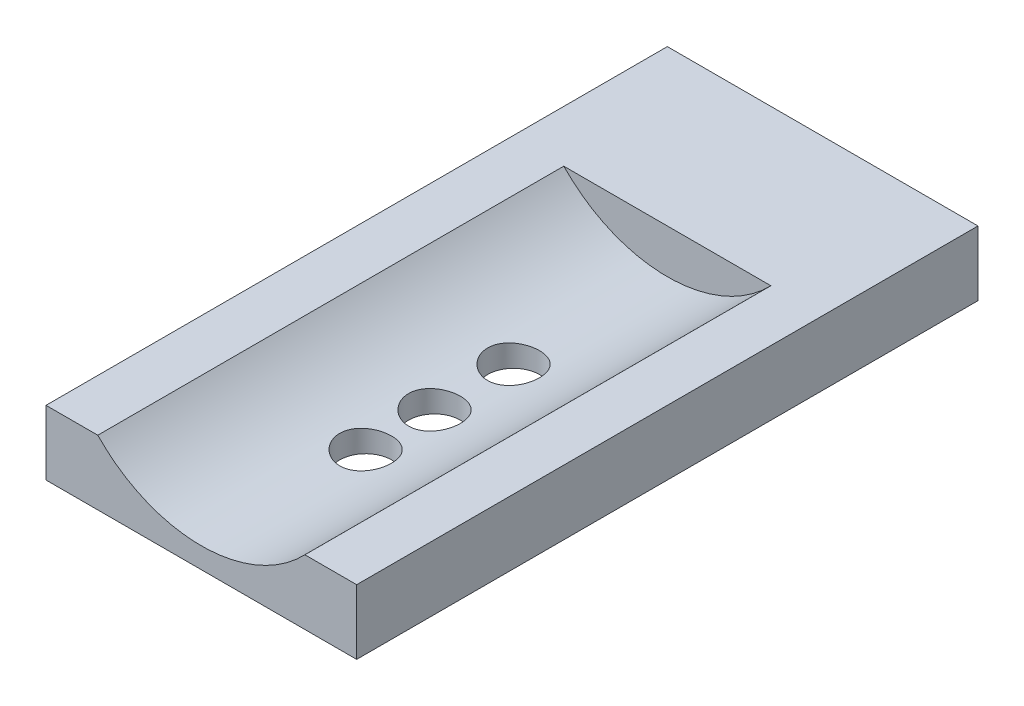
ISO-10303-21;
HEADER;
FILE_DESCRIPTION(('STEP AP214'),'2;1');
FILE_NAME('part.step','',(''),(''),'','','');
FILE_SCHEMA(('AUTOMOTIVE_DESIGN { 1 0 10303 214 1 1 1 1 }'));
ENDSEC;
DATA;
#1=APPLICATION_CONTEXT('core data for automotive mechanical design processes');
#2=APPLICATION_PROTOCOL_DEFINITION('international standard','automotive_design',2000,#1);
#3=PRODUCT_CONTEXT('',#1,'mechanical');
#4=PRODUCT('Part','Part','',(#3));
#5=PRODUCT_RELATED_PRODUCT_CATEGORY('part','',(#4));
#6=PRODUCT_DEFINITION_FORMATION('','',#4);
#7=PRODUCT_DEFINITION_CONTEXT('part definition',#1,'design');
#8=PRODUCT_DEFINITION('design','',#6,#7);
#9=PRODUCT_DEFINITION_SHAPE('','',#8);
#10=(LENGTH_UNIT() NAMED_UNIT(*) SI_UNIT(.MILLI.,.METRE.));
#11=(NAMED_UNIT(*) PLANE_ANGLE_UNIT() SI_UNIT($,.RADIAN.));
#12=(NAMED_UNIT(*) SI_UNIT($,.STERADIAN.) SOLID_ANGLE_UNIT());
#13=UNCERTAINTY_MEASURE_WITH_UNIT(LENGTH_MEASURE(1.E-05),#10,'distance_accuracy_value','');
#14=(GEOMETRIC_REPRESENTATION_CONTEXT(3) GLOBAL_UNCERTAINTY_ASSIGNED_CONTEXT((#13)) GLOBAL_UNIT_ASSIGNED_CONTEXT((#10,
#11,#12)) REPRESENTATION_CONTEXT('',''));
#15=CARTESIAN_POINT('',(0.,0.,0.));
#16=DIRECTION('',(0.,0.,1.));
#17=DIRECTION('',(1.,0.,0.));
#18=AXIS2_PLACEMENT_3D('',#15,#16,#17);
#19=CARTESIAN_POINT('',(30.,0.,0.));
#20=DIRECTION('',(0.,1.,0.));
#21=DIRECTION('',(0.,0.,1.));
#22=AXIS2_PLACEMENT_3D('',#19,#20,#21);
#23=PLANE('',#22);
#24=DIRECTION('',(0.,0.,-1.));
#25=VECTOR('',#24,1.);
#26=CARTESIAN_POINT('',(0.,0.,0.));
#27=LINE('',#26,#25);
#28=CARTESIAN_POINT('',(0.,0.,0.));
#29=VERTEX_POINT('',#28);
#30=CARTESIAN_POINT('',(0.,0.,-60.));
#31=VERTEX_POINT('',#30);
#32=EDGE_CURVE('E271',#29,#31,#27,.T.);
#33=ORIENTED_EDGE('',*,*,#32,.T.);
#34=DIRECTION('',(-1.,0.,0.));
#35=VECTOR('',#34,1.);
#36=CARTESIAN_POINT('',(30.,0.,-60.));
#37=LINE('',#36,#35);
#38=CARTESIAN_POINT('',(30.,0.,-60.));
#39=VERTEX_POINT('',#38);
#40=EDGE_CURVE('E47',#39,#31,#37,.T.);
#41=ORIENTED_EDGE('',*,*,#40,.F.);
#42=DIRECTION('',(0.,0.,-1.));
#43=VECTOR('',#42,1.);
#44=CARTESIAN_POINT('',(30.,0.,0.));
#45=LINE('',#44,#43);
#46=CARTESIAN_POINT('',(30.,0.,0.));
#47=VERTEX_POINT('',#46);
#48=EDGE_CURVE('E261',#47,#39,#45,.T.);
#49=ORIENTED_EDGE('',*,*,#48,.F.);
#50=DIRECTION('',(-1.,0.,0.));
#51=VECTOR('',#50,1.);
#52=CARTESIAN_POINT('',(30.,0.,0.));
#53=LINE('',#52,#51);
#54=EDGE_CURVE('E11',#47,#29,#53,.T.);
#55=ORIENTED_EDGE('',*,*,#54,.T.);
#56=EDGE_LOOP('',(#33,#41,#49,#55));
#57=FACE_BOUND('',#56,.T.);
#58=CARTESIAN_POINT('',(15.,0.,-30.15));
#59=DIRECTION('',(0.,-1.,0.));
#60=DIRECTION('',(0.,0.,-1.));
#61=AXIS2_PLACEMENT_3D('',#58,#59,#60);
#62=CIRCLE('',#61,2.5);
#63=CARTESIAN_POINT('',(15.,0.,-32.65));
#64=VERTEX_POINT('',#63);
#65=EDGE_CURVE('E205',#64,#64,#62,.T.);
#66=ORIENTED_EDGE('',*,*,#65,.F.);
#67=EDGE_LOOP('',(#66));
#68=FACE_BOUND('',#67,.T.);
#69=CARTESIAN_POINT('',(15.,0.,-22.52));
#70=DIRECTION('',(0.,-1.,0.));
#71=DIRECTION('',(0.,0.,-1.));
#72=AXIS2_PLACEMENT_3D('',#69,#70,#71);
#73=CIRCLE('',#72,2.5);
#74=CARTESIAN_POINT('',(15.,0.,-25.02));
#75=VERTEX_POINT('',#74);
#76=EDGE_CURVE('E202',#75,#75,#73,.T.);
#77=ORIENTED_EDGE('',*,*,#76,.F.);
#78=EDGE_LOOP('',(#77));
#79=FACE_BOUND('',#78,.T.);
#80=CARTESIAN_POINT('',(15.,0.,-15.87));
#81=DIRECTION('',(0.,-1.,0.));
#82=DIRECTION('',(0.,0.,-1.));
#83=AXIS2_PLACEMENT_3D('',#80,#81,#82);
#84=CIRCLE('',#83,2.5);
#85=CARTESIAN_POINT('',(15.,0.,-18.37));
#86=VERTEX_POINT('',#85);
#87=EDGE_CURVE('E206',#86,#86,#84,.T.);
#88=ORIENTED_EDGE('',*,*,#87,.F.);
#89=EDGE_LOOP('',(#88));
#90=FACE_BOUND('',#89,.T.);
#91=DIRECTION('',(0.,0.,1.));
#92=VECTOR('',#91,1.);
#93=CARTESIAN_POINT('',(7.19999999999998,0.,0.));
#94=LINE('',#93,#92);
#95=CARTESIAN_POINT('',(7.2,0.,-56.1));
#96=VERTEX_POINT('',#95);
#97=CARTESIAN_POINT('',(7.19999999999999,0.,-45.6));
#98=VERTEX_POINT('',#97);
#99=EDGE_CURVE('E196',#96,#98,#94,.T.);
#100=ORIENTED_EDGE('',*,*,#99,.T.);
#101=DIRECTION('',(1.,0.,0.));
#102=VECTOR('',#101,1.);
#103=CARTESIAN_POINT('',(0.,0.,-45.6));
#104=LINE('',#103,#102);
#105=CARTESIAN_POINT('',(22.8,0.,-45.6));
#106=VERTEX_POINT('',#105);
#107=EDGE_CURVE('E214',#98,#106,#104,.T.);
#108=ORIENTED_EDGE('',*,*,#107,.T.);
#109=DIRECTION('',(0.,0.,-1.));
#110=VECTOR('',#109,1.);
#111=CARTESIAN_POINT('',(22.8,0.,0.));
#112=LINE('',#111,#110);
#113=CARTESIAN_POINT('',(22.8,0.,-56.1));
#114=VERTEX_POINT('',#113);
#115=EDGE_CURVE('E228',#106,#114,#112,.T.);
#116=ORIENTED_EDGE('',*,*,#115,.T.);
#117=DIRECTION('',(-1.,0.,0.));
#118=VECTOR('',#117,1.);
#119=CARTESIAN_POINT('',(0.,0.,-56.1));
#120=LINE('',#119,#118);
#121=EDGE_CURVE('E225',#114,#96,#120,.T.);
#122=ORIENTED_EDGE('',*,*,#121,.T.);
#123=EDGE_LOOP('',(#100,#108,#116,#122));
#124=FACE_BOUND('',#123,.T.);
#125=ADVANCED_FACE('F33',(#57,#68,#79,#90,#124),#23,.F.);
#126=CARTESIAN_POINT('',(30.,6.25,0.));
#127=DIRECTION('',(0.,0.,-1.));
#128=DIRECTION('',(-1.,0.,0.));
#129=AXIS2_PLACEMENT_3D('',#126,#127,#128);
#130=PLANE('',#129);
#131=CARTESIAN_POINT('',(15.,15.8897058823529,0.));
#132=DIRECTION('',(0.,0.,-1.));
#133=DIRECTION('',(-1.,0.,0.));
#134=AXIS2_PLACEMENT_3D('',#131,#132,#133);
#135=CIRCLE('',#134,13.8897058823529);
#136=CARTESIAN_POINT('',(25.,6.25,0.));
#137=VERTEX_POINT('',#136);
#138=CARTESIAN_POINT('',(5.,6.25,0.));
#139=VERTEX_POINT('',#138);
#140=EDGE_CURVE('E248',#137,#139,#135,.T.);
#141=ORIENTED_EDGE('',*,*,#140,.T.);
#142=DIRECTION('',(-1.,0.,0.));
#143=VECTOR('',#142,1.);
#144=CARTESIAN_POINT('',(30.,6.25,0.));
#145=LINE('',#144,#143);
#146=CARTESIAN_POINT('',(0.,6.25,0.));
#147=VERTEX_POINT('',#146);
#148=EDGE_CURVE('E268',#139,#147,#145,.T.);
#149=ORIENTED_EDGE('',*,*,#148,.T.);
#150=DIRECTION('',(0.,-1.,0.));
#151=VECTOR('',#150,1.);
#152=CARTESIAN_POINT('',(0.,6.25,0.));
#153=LINE('',#152,#151);
#154=EDGE_CURVE('E256',#147,#29,#153,.T.);
#155=ORIENTED_EDGE('',*,*,#154,.T.);
#156=ORIENTED_EDGE('',*,*,#54,.F.);
#157=DIRECTION('',(0.,-1.,0.));
#158=VECTOR('',#157,1.);
#159=CARTESIAN_POINT('',(30.,6.25,0.));
#160=LINE('',#159,#158);
#161=CARTESIAN_POINT('',(30.,6.25,0.));
#162=VERTEX_POINT('',#161);
#163=EDGE_CURVE('E258',#162,#47,#160,.T.);
#164=ORIENTED_EDGE('',*,*,#163,.F.);
#165=EDGE_CURVE('E277',#162,#137,#145,.T.);
#166=ORIENTED_EDGE('',*,*,#165,.T.);
#167=EDGE_LOOP('',(#141,#149,#155,#156,#164,#166));
#168=FACE_BOUND('',#167,.T.);
#169=ADVANCED_FACE('F35',(#168),#130,.F.);
#170=CARTESIAN_POINT('',(30.,6.25,-60.));
#171=DIRECTION('',(0.,-1.,0.));
#172=DIRECTION('',(0.,0.,-1.));
#173=AXIS2_PLACEMENT_3D('',#170,#171,#172);
#174=PLANE('',#173);
#175=DIRECTION('',(0.,0.,-1.));
#176=VECTOR('',#175,1.);
#177=CARTESIAN_POINT('',(5.,6.25,84.2157061138241));
#178=LINE('',#177,#176);
#179=CARTESIAN_POINT('',(5.,6.25,-45.));
#180=VERTEX_POINT('',#179);
#181=EDGE_CURVE('E253',#139,#180,#178,.T.);
#182=ORIENTED_EDGE('',*,*,#181,.T.);
#183=DIRECTION('',(-1.,0.,0.));
#184=VECTOR('',#183,1.);
#185=CARTESIAN_POINT('',(30.,6.25,-45.));
#186=LINE('',#185,#184);
#187=CARTESIAN_POINT('',(25.,6.25,-45.));
#188=VERTEX_POINT('',#187);
#189=EDGE_CURVE('E251',#188,#180,#186,.T.);
#190=ORIENTED_EDGE('',*,*,#189,.F.);
#191=DIRECTION('',(0.,0.,-1.));
#192=VECTOR('',#191,1.);
#193=CARTESIAN_POINT('',(25.,6.25,84.2157061138241));
#194=LINE('',#193,#192);
#195=EDGE_CURVE('E247',#137,#188,#194,.T.);
#196=ORIENTED_EDGE('',*,*,#195,.F.);
#197=ORIENTED_EDGE('',*,*,#165,.F.);
#198=DIRECTION('',(0.,0.,1.));
#199=VECTOR('',#198,1.);
#200=CARTESIAN_POINT('',(30.,6.25,-60.));
#201=LINE('',#200,#199);
#202=CARTESIAN_POINT('',(30.,6.25,-60.));
#203=VERTEX_POINT('',#202);
#204=EDGE_CURVE('E266',#203,#162,#201,.T.);
#205=ORIENTED_EDGE('',*,*,#204,.F.);
#206=DIRECTION('',(-1.,0.,0.));
#207=VECTOR('',#206,1.);
#208=CARTESIAN_POINT('',(30.,6.25,-60.));
#209=LINE('',#208,#207);
#210=CARTESIAN_POINT('',(0.,6.25,-60.));
#211=VERTEX_POINT('',#210);
#212=EDGE_CURVE('E280',#203,#211,#209,.T.);
#213=ORIENTED_EDGE('',*,*,#212,.T.);
#214=DIRECTION('',(0.,0.,1.));
#215=VECTOR('',#214,1.);
#216=CARTESIAN_POINT('',(0.,6.25,-60.));
#217=LINE('',#216,#215);
#218=EDGE_CURVE('E262',#211,#147,#217,.T.);
#219=ORIENTED_EDGE('',*,*,#218,.T.);
#220=ORIENTED_EDGE('',*,*,#148,.F.);
#221=EDGE_LOOP('',(#182,#190,#196,#197,#205,#213,#219,#220));
#222=FACE_BOUND('',#221,.T.);
#223=ADVANCED_FACE('F358',(#222),#174,.F.);
#224=CARTESIAN_POINT('',(30.,0.,-60.));
#225=DIRECTION('',(0.,0.,1.));
#226=DIRECTION('',(0.,-1.,0.));
#227=AXIS2_PLACEMENT_3D('',#224,#225,#226);
#228=PLANE('',#227);
#229=DIRECTION('',(1.,0.,0.));
#230=VECTOR('',#229,1.);
#231=CARTESIAN_POINT('',(20.,4.25,-60.));
#232=LINE('',#231,#230);
#233=CARTESIAN_POINT('',(10.,4.25,-60.));
#234=VERTEX_POINT('',#233);
#235=CARTESIAN_POINT('',(20.,4.25,-60.));
#236=VERTEX_POINT('',#235);
#237=EDGE_CURVE('E184',#234,#236,#232,.T.);
#238=ORIENTED_EDGE('',*,*,#237,.F.);
#239=DIRECTION('',(0.,1.,0.));
#240=VECTOR('',#239,1.);
#241=CARTESIAN_POINT('',(10.,4.25,-60.));
#242=LINE('',#241,#240);
#243=CARTESIAN_POINT('',(10.,1.25,-60.));
#244=VERTEX_POINT('',#243);
#245=EDGE_CURVE('E55',#244,#234,#242,.T.);
#246=ORIENTED_EDGE('',*,*,#245,.F.);
#247=DIRECTION('',(-1.,0.,0.));
#248=VECTOR('',#247,1.);
#249=CARTESIAN_POINT('',(10.,1.25,-60.));
#250=LINE('',#249,#248);
#251=CARTESIAN_POINT('',(20.,1.25,-60.));
#252=VERTEX_POINT('',#251);
#253=EDGE_CURVE('E162',#252,#244,#250,.T.);
#254=ORIENTED_EDGE('',*,*,#253,.F.);
#255=DIRECTION('',(0.707106781186547,-0.707106781186548,0.));
#256=VECTOR('',#255,1.);
#257=CARTESIAN_POINT('',(20.,1.25,-60.));
#258=LINE('',#257,#256);
#259=CARTESIAN_POINT('',(18.5,2.75,-60.));
#260=VERTEX_POINT('',#259);
#261=EDGE_CURVE('E189',#260,#252,#258,.T.);
#262=ORIENTED_EDGE('',*,*,#261,.F.);
#263=DIRECTION('',(-0.707106781186547,-0.707106781186548,0.));
#264=VECTOR('',#263,1.);
#265=CARTESIAN_POINT('',(18.5,2.75,-60.));
#266=LINE('',#265,#264);
#267=EDGE_CURVE('E186',#236,#260,#266,.T.);
#268=ORIENTED_EDGE('',*,*,#267,.F.);
#269=EDGE_LOOP('',(#238,#246,#254,#262,#268));
#270=FACE_BOUND('',#269,.T.);
#271=DIRECTION('',(0.,1.,0.));
#272=VECTOR('',#271,1.);
#273=CARTESIAN_POINT('',(0.,0.,-60.));
#274=LINE('',#273,#272);
#275=EDGE_CURVE('E273',#31,#211,#274,.T.);
#276=ORIENTED_EDGE('',*,*,#275,.T.);
#277=ORIENTED_EDGE('',*,*,#212,.F.);
#278=DIRECTION('',(0.,1.,0.));
#279=VECTOR('',#278,1.);
#280=CARTESIAN_POINT('',(30.,0.,-60.));
#281=LINE('',#280,#279);
#282=EDGE_CURVE('E264',#39,#203,#281,.T.);
#283=ORIENTED_EDGE('',*,*,#282,.F.);
#284=ORIENTED_EDGE('',*,*,#40,.T.);
#285=EDGE_LOOP('',(#276,#277,#283,#284));
#286=FACE_BOUND('',#285,.T.);
#287=ADVANCED_FACE('F362',(#270,#286),#228,.F.);
#288=CARTESIAN_POINT('',(30.,0.,0.));
#289=DIRECTION('',(1.,0.,0.));
#290=DIRECTION('',(0.,0.,-1.));
#291=AXIS2_PLACEMENT_3D('',#288,#289,#290);
#292=PLANE('',#291);
#293=ORIENTED_EDGE('',*,*,#163,.T.);
#294=ORIENTED_EDGE('',*,*,#48,.T.);
#295=ORIENTED_EDGE('',*,*,#282,.T.);
#296=ORIENTED_EDGE('',*,*,#204,.T.);
#297=EDGE_LOOP('',(#293,#294,#295,#296));
#298=FACE_BOUND('',#297,.T.);
#299=ADVANCED_FACE('F365',(#298),#292,.T.);
#300=CARTESIAN_POINT('',(0.,0.,0.));
#301=DIRECTION('',(1.,0.,0.));
#302=DIRECTION('',(0.,0.,-1.));
#303=AXIS2_PLACEMENT_3D('',#300,#301,#302);
#304=PLANE('',#303);
#305=ORIENTED_EDGE('',*,*,#154,.F.);
#306=ORIENTED_EDGE('',*,*,#218,.F.);
#307=ORIENTED_EDGE('',*,*,#275,.F.);
#308=ORIENTED_EDGE('',*,*,#32,.F.);
#309=EDGE_LOOP('',(#305,#306,#307,#308));
#310=FACE_BOUND('',#309,.T.);
#311=ADVANCED_FACE('F370',(#310),#304,.F.);
#312=CARTESIAN_POINT('',(15.,15.8897058823529,84.2157061138241));
#313=DIRECTION('',(0.,0.,-1.));
#314=DIRECTION('',(-1.,0.,0.));
#315=AXIS2_PLACEMENT_3D('',#312,#313,#314);
#316=CYLINDRICAL_SURFACE('',#315,13.8897058823529);
#317=CARTESIAN_POINT('',(15.,2.,-18.37));
#318=CARTESIAN_POINT('',(14.8607791021777,2.0000024805035,-18.3699945764934));
#319=CARTESIAN_POINT('',(14.7214864513585,2.00211486624746,-18.3583312295151));
#320=CARTESIAN_POINT('',(14.4468194472733,2.01033806250504,-18.3120120615418));
#321=CARTESIAN_POINT('',(14.311448619219,2.0164523604776,-18.2773361859537));
#322=CARTESIAN_POINT('',(14.0486378673352,2.03199473178903,-18.1860824585121));
#323=CARTESIAN_POINT('',(13.9211911436507,2.04141991646545,-18.1295236945606));
#324=CARTESIAN_POINT('',(13.6776095708891,2.06255219534269,-17.9961623396542));
#325=CARTESIAN_POINT('',(13.5614736674087,2.07425907653611,-17.9193616381464));
#326=CARTESIAN_POINT('',(13.3425106756272,2.09880547250551,-17.7467928315562));
#327=CARTESIAN_POINT('',(13.2398270112381,2.11165506935691,-17.6508441588513));
#328=CARTESIAN_POINT('',(13.0519233905755,2.13696297401883,-17.4430915766365));
#329=CARTESIAN_POINT('',(12.966704629957,2.14942125499031,-17.3312865824818));
#330=CARTESIAN_POINT('',(12.8155613808671,2.17263377959116,-17.0939919851965));
#331=CARTESIAN_POINT('',(12.7497812809449,2.18337501174614,-16.9684090302615));
#332=CARTESIAN_POINT('',(12.6403065530878,2.20179597426759,-16.7077494918428));
#333=CARTESIAN_POINT('',(12.5966101762896,2.2094759470524,-16.5726736610882));
#334=CARTESIAN_POINT('',(12.5330004725406,2.22080373902867,-16.2983921467513));
#335=CARTESIAN_POINT('',(12.5128379311884,2.22449377872679,-16.159246037115));
#336=CARTESIAN_POINT('',(12.4960950071074,2.22755134303874,-15.8795006550782));
#337=CARTESIAN_POINT('',(12.4995126771976,2.22691922456306,-15.7389015036227));
#338=CARTESIAN_POINT('',(12.5296307409705,2.22144237554321,-15.4620366872864));
#339=CARTESIAN_POINT('',(12.5560490398265,2.2166486872619,-15.3257391773847));
#340=CARTESIAN_POINT('',(12.6309747661556,2.20346889463448,-15.0595430822705));
#341=CARTESIAN_POINT('',(12.6794830651306,2.19508264855438,-14.9296447497446));
#342=CARTESIAN_POINT('',(12.7974914597604,2.17560863433095,-14.6791018263699));
#343=CARTESIAN_POINT('',(12.8671066655797,2.16450611832108,-14.5585126472091));
#344=CARTESIAN_POINT('',(13.0252712286651,2.14086046484447,-14.3306207061338));
#345=CARTESIAN_POINT('',(13.1138223611787,2.12831719235755,-14.2233191914313));
#346=CARTESIAN_POINT('',(13.3088720741001,2.1029802222803,-14.0234174526796));
#347=CARTESIAN_POINT('',(13.415612224325,2.09018553037849,-13.9310528992295));
#348=CARTESIAN_POINT('',(13.6431984523319,2.06595482481817,-13.7655073071965));
#349=CARTESIAN_POINT('',(13.7640446512733,2.0545188228314,-13.6923264334032));
#350=CARTESIAN_POINT('',(14.0166493604722,2.03427361150229,-13.5671958076776));
#351=CARTESIAN_POINT('',(14.1484195722588,2.02546726667231,-13.515269185565));
#352=CARTESIAN_POINT('',(14.4190055307139,2.01149602706562,-13.4343520021389));
#353=CARTESIAN_POINT('',(14.5578205871516,2.00633077628201,-13.4053591984443));
#354=CARTESIAN_POINT('',(14.8365268553118,2.00027222388904,-13.3714574822163));
#355=CARTESIAN_POINT('',(14.9763775568768,1.99932160971193,-13.3662254359726));
#356=CARTESIAN_POINT('',(15.2549560535414,2.00164162463307,-13.3791289548946));
#357=CARTESIAN_POINT('',(15.39368389903,2.00491206323921,-13.3972634655497));
#358=CARTESIAN_POINT('',(15.6650637908511,2.01527110864466,-13.456116611138));
#359=CARTESIAN_POINT('',(15.7977521487213,2.02233228452273,-13.4966730563074));
#360=CARTESIAN_POINT('',(16.0544461675113,2.03948435730314,-13.5990442867302));
#361=CARTESIAN_POINT('',(16.1784512751435,2.04957544705225,-13.6608604251487));
#362=CARTESIAN_POINT('',(16.4156469993614,2.07181082878398,-13.8047207704866));
#363=CARTESIAN_POINT('',(16.5287149696055,2.08397493556902,-13.8869640717585));
#364=CARTESIAN_POINT('',(16.7395606134302,2.10895295176231,-14.069073096253));
#365=CARTESIAN_POINT('',(16.8373369773516,2.12176691670374,-14.1689403273308));
#366=CARTESIAN_POINT('',(17.0160405890834,2.14678879029548,-14.3849202934621));
#367=CARTESIAN_POINT('',(17.0967481141807,2.15898741643066,-14.5012160797061));
#368=CARTESIAN_POINT('',(17.2374820916902,2.181215785833,-14.7459043558772));
#369=CARTESIAN_POINT('',(17.2975092735963,2.19124560559961,-14.8742964189077));
#370=CARTESIAN_POINT('',(17.394860655224,2.20792908307173,-15.1389537737917));
#371=CARTESIAN_POINT('',(17.4322887886537,2.21459817306882,-15.2751798170153));
#372=CARTESIAN_POINT('',(17.4837027716111,2.22384168087247,-15.5521170656855));
#373=CARTESIAN_POINT('',(17.4976910360621,2.2264165204932,-15.6928278075677));
#374=CARTESIAN_POINT('',(17.5017523819745,2.22715978419761,-15.972541964547));
#375=CARTESIAN_POINT('',(17.4921717549074,2.22539201364681,-16.1115403013155));
#376=CARTESIAN_POINT('',(17.4501219324046,2.21779010715331,-16.3859114188399));
#377=CARTESIAN_POINT('',(17.4176528489727,2.21195599110911,-16.5212842173339));
#378=CARTESIAN_POINT('',(17.3308889689079,2.19690465285668,-16.7843947546296));
#379=CARTESIAN_POINT('',(17.2766288147146,2.1876928024271,-16.9121442441073));
#380=CARTESIAN_POINT('',(17.147859981333,2.16691965747693,-17.1567823099269));
#381=CARTESIAN_POINT('',(17.073350028407,2.15535821517561,-17.2736702024397));
#382=CARTESIAN_POINT('',(16.9049807486239,2.13098891445584,-17.4950073743143));
#383=CARTESIAN_POINT('',(16.8108683454191,2.11816604413767,-17.5992625190202));
#384=CARTESIAN_POINT('',(16.6064959061238,2.09283373229091,-17.7906171464878));
#385=CARTESIAN_POINT('',(16.496232161839,2.08032436351376,-17.8777126787682));
#386=CARTESIAN_POINT('',(16.2616064283595,2.056908669821,-18.0329380730935));
#387=CARTESIAN_POINT('',(16.137136245715,2.0460163312857,-18.1009065570604));
#388=CARTESIAN_POINT('',(15.8783918055749,2.02719820604874,-18.2148607809756));
#389=CARTESIAN_POINT('',(15.7441271095981,2.01926957126147,-18.2608676376414));
#390=CARTESIAN_POINT('',(15.5078486615514,2.00893146410727,-18.3200087627592));
#391=CARTESIAN_POINT('',(15.4072351365043,2.00560069760491,-18.3387242025631));
#392=CARTESIAN_POINT('',(15.2044272813768,2.00113407909823,-18.3637216748825));
#393=CARTESIAN_POINT('',(15.1022329863365,1.99999817851138,-18.3700039826009));
#394=CARTESIAN_POINT('',(15.,2.,-18.37));
#395=B_SPLINE_CURVE_WITH_KNOTS('',3,(#317,#318,#319,#320,#321,#322,#323,#324,#325,#326,#327,
#328,#329,#330,#331,#332,#333,#334,#335,#336,#337,#338,#339,#340,#341,#342,#343,#344,#345,#346,
#347,#348,#349,#350,#351,#352,#353,#354,#355,#356,#357,#358,#359,#360,#361,#362,#363,#364,#365,
#366,#367,#368,#369,#370,#371,#372,#373,#374,#375,#376,#377,#378,#379,#380,#381,#382,#383,#384,
#385,#386,#387,#388,#389,#390,#391,#392,#393,#394),.UNSPECIFIED.,.T.,.F.,(4,2,2,2,2,2,2,2,2,2,2,
2,2,2,2,2,2,2,2,2,2,2,2,2,2,2,2,2,2,2,2,2,2,2,2,2,2,2,4),(0.,0.417288889969751,
0.834941910602371,1.25223144119795,1.66948203444179,2.09087100391676,2.51228881223599,
2.93676242853993,3.36120242448238,3.78110576894276,4.20097443949833,4.61576497248278,
5.03057187133712,5.44768297392588,5.86483319793312,6.28803073583834,6.71123190893125,
7.13489241164066,7.55851148532261,7.97635196682961,8.39417359225143,8.80901170373616,
9.22387622427176,9.64295485395033,10.0620693562488,10.4862885668467,10.9104928116857,
11.3327309663288,11.7549256166525,12.1709542217818,12.5869807911054,13.0023485822151,
13.4177425065277,13.838874744418,14.2601038222551,14.6847870462459,15.1090610988166,
15.4154923484635,15.7219168152923),.UNSPECIFIED.);
#396=CARTESIAN_POINT('',(15.,2.,-18.37));
#397=VERTEX_POINT('',#396);
#398=EDGE_CURVE('E37',#397,#397,#395,.T.);
#399=ORIENTED_EDGE('',*,*,#398,.F.);
#400=EDGE_LOOP('',(#399));
#401=FACE_BOUND('',#400,.T.);
#402=CARTESIAN_POINT('',(15.,2.,-25.02));
#403=CARTESIAN_POINT('',(14.8607791021777,2.0000024805035,-25.0199945764934));
#404=CARTESIAN_POINT('',(14.7214864513585,2.00211486624746,-25.0083312295151));
#405=CARTESIAN_POINT('',(14.4468194472733,2.01033806250504,-24.9620120615418));
#406=CARTESIAN_POINT('',(14.311448619219,2.0164523604776,-24.9273361859537));
#407=CARTESIAN_POINT('',(14.0486378673352,2.03199473178903,-24.8360824585121));
#408=CARTESIAN_POINT('',(13.9211911436507,2.04141991646545,-24.7795236945606));
#409=CARTESIAN_POINT('',(13.6776095708891,2.06255219534269,-24.6461623396542));
#410=CARTESIAN_POINT('',(13.5614736674087,2.07425907653611,-24.5693616381464));
#411=CARTESIAN_POINT('',(13.3425106756272,2.09880547250551,-24.3967928315562));
#412=CARTESIAN_POINT('',(13.2398270112381,2.11165506935691,-24.3008441588513));
#413=CARTESIAN_POINT('',(13.0519233905755,2.13696297401883,-24.0930915766364));
#414=CARTESIAN_POINT('',(12.966704629957,2.14942125499031,-23.9812865824818));
#415=CARTESIAN_POINT('',(12.8155613808671,2.17263377959116,-23.7439919851965));
#416=CARTESIAN_POINT('',(12.7497812809449,2.18337501174614,-23.6184090302615));
#417=CARTESIAN_POINT('',(12.6403065530878,2.20179597426759,-23.3577494918428));
#418=CARTESIAN_POINT('',(12.5966101762896,2.20947594705241,-23.2226736610882));
#419=CARTESIAN_POINT('',(12.5330004725406,2.22080373902867,-22.9483921467512));
#420=CARTESIAN_POINT('',(12.5128379311884,2.22449377872679,-22.809246037115));
#421=CARTESIAN_POINT('',(12.4960950071074,2.22755134303874,-22.5295006550782));
#422=CARTESIAN_POINT('',(12.4995126771976,2.22691922456306,-22.3889015036227));
#423=CARTESIAN_POINT('',(12.5296307409705,2.22144237554321,-22.1120366872864));
#424=CARTESIAN_POINT('',(12.5560490398265,2.2166486872619,-21.9757391773847));
#425=CARTESIAN_POINT('',(12.6309747661556,2.20346889463448,-21.7095430822705));
#426=CARTESIAN_POINT('',(12.6794830651306,2.19508264855438,-21.5796447497446));
#427=CARTESIAN_POINT('',(12.7974914597604,2.17560863433095,-21.3291018263699));
#428=CARTESIAN_POINT('',(12.8671066655797,2.16450611832108,-21.2085126472091));
#429=CARTESIAN_POINT('',(13.0252712286651,2.14086046484447,-20.9806207061338));
#430=CARTESIAN_POINT('',(13.1138223611787,2.12831719235754,-20.8733191914313));
#431=CARTESIAN_POINT('',(13.3088720741001,2.1029802222803,-20.6734174526796));
#432=CARTESIAN_POINT('',(13.4156122243251,2.09018553037849,-20.5810528992295));
#433=CARTESIAN_POINT('',(13.6431984523319,2.06595482481817,-20.4155073071965));
#434=CARTESIAN_POINT('',(13.7640446512733,2.0545188228314,-20.3423264334032));
#435=CARTESIAN_POINT('',(14.0166493604722,2.03427361150229,-20.2171958076776));
#436=CARTESIAN_POINT('',(14.1484195722588,2.02546726667231,-20.165269185565));
#437=CARTESIAN_POINT('',(14.4190055307139,2.01149602706562,-20.0843520021389));
#438=CARTESIAN_POINT('',(14.5578205871516,2.00633077628201,-20.0553591984443));
#439=CARTESIAN_POINT('',(14.8365268553118,2.00027222388904,-20.0214574822163));
#440=CARTESIAN_POINT('',(14.9763775568768,1.99932160971193,-20.0162254359726));
#441=CARTESIAN_POINT('',(15.2549560535414,2.00164162463308,-20.0291289548946));
#442=CARTESIAN_POINT('',(15.39368389903,2.00491206323922,-20.0472634655497));
#443=CARTESIAN_POINT('',(15.6650637908511,2.01527110864466,-20.106116611138));
#444=CARTESIAN_POINT('',(15.7977521487213,2.02233228452273,-20.1466730563074));
#445=CARTESIAN_POINT('',(16.0544461675113,2.03948435730314,-20.2490442867302));
#446=CARTESIAN_POINT('',(16.1784512751435,2.04957544705225,-20.3108604251487));
#447=CARTESIAN_POINT('',(16.4156469993614,2.07181082878398,-20.4547207704866));
#448=CARTESIAN_POINT('',(16.5287149696055,2.08397493556902,-20.5369640717585));
#449=CARTESIAN_POINT('',(16.7395606134302,2.10895295176231,-20.719073096253));
#450=CARTESIAN_POINT('',(16.8373369773516,2.12176691670374,-20.8189403273308));
#451=CARTESIAN_POINT('',(17.0160405890834,2.14678879029548,-21.0349202934621));
#452=CARTESIAN_POINT('',(17.0967481141807,2.15898741643066,-21.1512160797061));
#453=CARTESIAN_POINT('',(17.2374820916902,2.181215785833,-21.3959043558772));
#454=CARTESIAN_POINT('',(17.2975092735963,2.19124560559961,-21.5242964189077));
#455=CARTESIAN_POINT('',(17.394860655224,2.20792908307173,-21.7889537737917));
#456=CARTESIAN_POINT('',(17.4322887886537,2.21459817306882,-21.9251798170153));
#457=CARTESIAN_POINT('',(17.4837027716111,2.22384168087247,-22.2021170656855));
#458=CARTESIAN_POINT('',(17.4976910360621,2.2264165204932,-22.3428278075677));
#459=CARTESIAN_POINT('',(17.5017523819745,2.22715978419761,-22.622541964547));
#460=CARTESIAN_POINT('',(17.4921717549074,2.22539201364681,-22.7615403013155));
#461=CARTESIAN_POINT('',(17.4501219324046,2.21779010715331,-23.0359114188399));
#462=CARTESIAN_POINT('',(17.4176528489727,2.21195599110911,-23.1712842173339));
#463=CARTESIAN_POINT('',(17.3308889689079,2.19690465285668,-23.4343947546296));
#464=CARTESIAN_POINT('',(17.2766288147146,2.1876928024271,-23.5621442441073));
#465=CARTESIAN_POINT('',(17.147859981333,2.16691965747693,-23.8067823099268));
#466=CARTESIAN_POINT('',(17.073350028407,2.15535821517561,-23.9236702024398));
#467=CARTESIAN_POINT('',(16.9049807486239,2.13098891445584,-24.1450073743143));
#468=CARTESIAN_POINT('',(16.8108683454191,2.11816604413767,-24.2492625190202));
#469=CARTESIAN_POINT('',(16.6064959061238,2.09283373229091,-24.4406171464878));
#470=CARTESIAN_POINT('',(16.496232161839,2.08032436351376,-24.5277126787682));
#471=CARTESIAN_POINT('',(16.2616064283595,2.056908669821,-24.6829380730935));
#472=CARTESIAN_POINT('',(16.137136245715,2.0460163312857,-24.7509065570604));
#473=CARTESIAN_POINT('',(15.8783918055749,2.02719820604874,-24.8648607809756));
#474=CARTESIAN_POINT('',(15.7441271095981,2.01926957126147,-24.9108676376414));
#475=CARTESIAN_POINT('',(15.5078486615514,2.00893146410727,-24.9700087627592));
#476=CARTESIAN_POINT('',(15.4072351365043,2.00560069760491,-24.9887242025631));
#477=CARTESIAN_POINT('',(15.2044272813768,2.00113407909823,-25.0137216748825));
#478=CARTESIAN_POINT('',(15.1022329863365,1.99999817851138,-25.0200039826009));
#479=CARTESIAN_POINT('',(15.,2.,-25.02));
#480=B_SPLINE_CURVE_WITH_KNOTS('',3,(#402,#403,#404,#405,#406,#407,#408,#409,#410,#411,#412,
#413,#414,#415,#416,#417,#418,#419,#420,#421,#422,#423,#424,#425,#426,#427,#428,#429,#430,#431,
#432,#433,#434,#435,#436,#437,#438,#439,#440,#441,#442,#443,#444,#445,#446,#447,#448,#449,#450,
#451,#452,#453,#454,#455,#456,#457,#458,#459,#460,#461,#462,#463,#464,#465,#466,#467,#468,#469,
#470,#471,#472,#473,#474,#475,#476,#477,#478,#479),.UNSPECIFIED.,.T.,.F.,(4,2,2,2,2,2,2,2,2,2,2,
2,2,2,2,2,2,2,2,2,2,2,2,2,2,2,2,2,2,2,2,2,2,2,2,2,2,2,4),(0.,0.417288889969751,
0.834941910602372,1.25223144119795,1.66948203444179,2.09087100391676,2.51228881223599,
2.93676242853992,3.36120242448238,3.78110576894277,4.20097443949833,4.61576497248278,
5.03057187133712,5.44768297392588,5.86483319793313,6.28803073583834,6.71123190893125,
7.13489241164067,7.55851148532261,7.97635196682961,8.39417359225143,8.80901170373615,
9.22387622427175,9.64295485395032,10.0620693562488,10.4862885668467,10.9104928116857,
11.3327309663288,11.7549256166525,12.1709542217818,12.5869807911054,13.0023485822151,
13.4177425065277,13.838874744418,14.2601038222551,14.6847870462459,15.1090610988166,
15.4154923484635,15.7219168152923),.UNSPECIFIED.);
#481=CARTESIAN_POINT('',(15.,2.,-25.02));
#482=VERTEX_POINT('',#481);
#483=EDGE_CURVE('E290',#482,#482,#480,.T.);
#484=ORIENTED_EDGE('',*,*,#483,.F.);
#485=EDGE_LOOP('',(#484));
#486=FACE_BOUND('',#485,.T.);
#487=CARTESIAN_POINT('',(15.,2.,-32.65));
#488=CARTESIAN_POINT('',(14.8607791021777,2.0000024805035,-32.6499945764934));
#489=CARTESIAN_POINT('',(14.7214864513585,2.00211486624746,-32.6383312295151));
#490=CARTESIAN_POINT('',(14.4468194472733,2.01033806250504,-32.5920120615418));
#491=CARTESIAN_POINT('',(14.311448619219,2.0164523604776,-32.5573361859537));
#492=CARTESIAN_POINT('',(14.0486378673352,2.03199473178903,-32.4660824585121));
#493=CARTESIAN_POINT('',(13.9211911436507,2.04141991646545,-32.4095236945607));
#494=CARTESIAN_POINT('',(13.6776095708891,2.06255219534269,-32.2761623396542));
#495=CARTESIAN_POINT('',(13.5614736674088,2.07425907653611,-32.1993616381464));
#496=CARTESIAN_POINT('',(13.3425106756272,2.09880547250551,-32.0267928315562));
#497=CARTESIAN_POINT('',(13.2398270112381,2.1116550693569,-31.9308441588513));
#498=CARTESIAN_POINT('',(13.0519233905755,2.13696297401883,-31.7230915766365));
#499=CARTESIAN_POINT('',(12.966704629957,2.14942125499031,-31.6112865824818));
#500=CARTESIAN_POINT('',(12.8155613808671,2.17263377959116,-31.3739919851965));
#501=CARTESIAN_POINT('',(12.7497812809449,2.18337501174614,-31.2484090302615));
#502=CARTESIAN_POINT('',(12.6403065530878,2.20179597426759,-30.9877494918428));
#503=CARTESIAN_POINT('',(12.5966101762896,2.2094759470524,-30.8526736610882));
#504=CARTESIAN_POINT('',(12.5330004725406,2.22080373902867,-30.5783921467512));
#505=CARTESIAN_POINT('',(12.5128379311884,2.22449377872679,-30.439246037115));
#506=CARTESIAN_POINT('',(12.4960950071074,2.22755134303874,-30.1595006550782));
#507=CARTESIAN_POINT('',(12.4995126771976,2.22691922456307,-30.0189015036227));
#508=CARTESIAN_POINT('',(12.5296307409705,2.22144237554321,-29.7420366872864));
#509=CARTESIAN_POINT('',(12.5560490398265,2.2166486872619,-29.6057391773847));
#510=CARTESIAN_POINT('',(12.6309747661556,2.20346889463448,-29.3395430822705));
#511=CARTESIAN_POINT('',(12.6794830651306,2.19508264855438,-29.2096447497446));
#512=CARTESIAN_POINT('',(12.7974914597604,2.17560863433095,-28.9591018263699));
#513=CARTESIAN_POINT('',(12.8671066655797,2.16450611832108,-28.8385126472091));
#514=CARTESIAN_POINT('',(13.0252712286651,2.14086046484447,-28.6106207061338));
#515=CARTESIAN_POINT('',(13.1138223611787,2.12831719235754,-28.5033191914313));
#516=CARTESIAN_POINT('',(13.3088720741001,2.1029802222803,-28.3034174526796));
#517=CARTESIAN_POINT('',(13.415612224325,2.09018553037849,-28.2110528992295));
#518=CARTESIAN_POINT('',(13.6431984523319,2.06595482481818,-28.0455073071965));
#519=CARTESIAN_POINT('',(13.7640446512733,2.0545188228314,-27.9723264334032));
#520=CARTESIAN_POINT('',(14.0166493604722,2.03427361150229,-27.8471958076776));
#521=CARTESIAN_POINT('',(14.1484195722588,2.02546726667231,-27.795269185565));
#522=CARTESIAN_POINT('',(14.4190055307139,2.01149602706562,-27.7143520021389));
#523=CARTESIAN_POINT('',(14.5578205871516,2.00633077628201,-27.6853591984443));
#524=CARTESIAN_POINT('',(14.8365268553118,2.00027222388904,-27.6514574822163));
#525=CARTESIAN_POINT('',(14.9763775568768,1.99932160971193,-27.6462254359726));
#526=CARTESIAN_POINT('',(15.2549560535414,2.00164162463308,-27.6591289548946));
#527=CARTESIAN_POINT('',(15.39368389903,2.00491206323922,-27.6772634655497));
#528=CARTESIAN_POINT('',(15.6650637908511,2.01527110864466,-27.7361166111381));
#529=CARTESIAN_POINT('',(15.7977521487213,2.02233228452273,-27.7766730563074));
#530=CARTESIAN_POINT('',(16.0544461675113,2.03948435730314,-27.8790442867303));
#531=CARTESIAN_POINT('',(16.1784512751435,2.04957544705225,-27.9408604251487));
#532=CARTESIAN_POINT('',(16.4156469993614,2.07181082878398,-28.0847207704866));
#533=CARTESIAN_POINT('',(16.5287149696055,2.08397493556902,-28.1669640717585));
#534=CARTESIAN_POINT('',(16.7395606134302,2.10895295176231,-28.349073096253));
#535=CARTESIAN_POINT('',(16.8373369773516,2.12176691670374,-28.4489403273308));
#536=CARTESIAN_POINT('',(17.0160405890834,2.14678879029548,-28.6649202934621));
#537=CARTESIAN_POINT('',(17.0967481141807,2.15898741643066,-28.7812160797061));
#538=CARTESIAN_POINT('',(17.2374820916902,2.181215785833,-29.0259043558772));
#539=CARTESIAN_POINT('',(17.2975092735963,2.19124560559961,-29.1542964189077));
#540=CARTESIAN_POINT('',(17.394860655224,2.20792908307173,-29.4189537737917));
#541=CARTESIAN_POINT('',(17.4322887886537,2.21459817306882,-29.5551798170153));
#542=CARTESIAN_POINT('',(17.4837027716111,2.22384168087247,-29.8321170656855));
#543=CARTESIAN_POINT('',(17.4976910360621,2.2264165204932,-29.9728278075677));
#544=CARTESIAN_POINT('',(17.5017523819745,2.22715978419761,-30.252541964547));
#545=CARTESIAN_POINT('',(17.4921717549074,2.22539201364681,-30.3915403013155));
#546=CARTESIAN_POINT('',(17.4501219324046,2.21779010715331,-30.6659114188399));
#547=CARTESIAN_POINT('',(17.4176528489727,2.21195599110911,-30.8012842173339));
#548=CARTESIAN_POINT('',(17.3308889689079,2.19690465285668,-31.0643947546296));
#549=CARTESIAN_POINT('',(17.2766288147146,2.1876928024271,-31.1921442441073));
#550=CARTESIAN_POINT('',(17.147859981333,2.16691965747693,-31.4367823099269));
#551=CARTESIAN_POINT('',(17.073350028407,2.15535821517561,-31.5536702024398));
#552=CARTESIAN_POINT('',(16.9049807486239,2.13098891445584,-31.7750073743143));
#553=CARTESIAN_POINT('',(16.8108683454191,2.11816604413767,-31.8792625190202));
#554=CARTESIAN_POINT('',(16.6064959061238,2.09283373229091,-32.0706171464878));
#555=CARTESIAN_POINT('',(16.496232161839,2.08032436351376,-32.1577126787682));
#556=CARTESIAN_POINT('',(16.2616064283595,2.056908669821,-32.3129380730935));
#557=CARTESIAN_POINT('',(16.137136245715,2.0460163312857,-32.3809065570604));
#558=CARTESIAN_POINT('',(15.8783918055749,2.02719820604874,-32.4948607809756));
#559=CARTESIAN_POINT('',(15.7441271095981,2.01926957126147,-32.5408676376414));
#560=CARTESIAN_POINT('',(15.5078486615514,2.00893146410727,-32.6000087627592));
#561=CARTESIAN_POINT('',(15.4072351365043,2.00560069760491,-32.6187242025631));
#562=CARTESIAN_POINT('',(15.2044272813768,2.00113407909823,-32.6437216748825));
#563=CARTESIAN_POINT('',(15.1022329863365,1.99999817851138,-32.6500039826009));
#564=CARTESIAN_POINT('',(15.,2.,-32.65));
#565=B_SPLINE_CURVE_WITH_KNOTS('',3,(#487,#488,#489,#490,#491,#492,#493,#494,#495,#496,#497,
#498,#499,#500,#501,#502,#503,#504,#505,#506,#507,#508,#509,#510,#511,#512,#513,#514,#515,#516,
#517,#518,#519,#520,#521,#522,#523,#524,#525,#526,#527,#528,#529,#530,#531,#532,#533,#534,#535,
#536,#537,#538,#539,#540,#541,#542,#543,#544,#545,#546,#547,#548,#549,#550,#551,#552,#553,#554,
#555,#556,#557,#558,#559,#560,#561,#562,#563,#564),.UNSPECIFIED.,.T.,.F.,(4,2,2,2,2,2,2,2,2,2,2,
2,2,2,2,2,2,2,2,2,2,2,2,2,2,2,2,2,2,2,2,2,2,2,2,2,2,2,4),(0.,0.417288889969751,
0.834941910602372,1.25223144119794,1.66948203444179,2.09087100391676,2.51228881223599,
2.93676242853992,3.36120242448238,3.78110576894276,4.20097443949833,4.61576497248278,
5.03057187133712,5.44768297392588,5.86483319793312,6.28803073583834,6.71123190893125,
7.13489241164067,7.55851148532261,7.9763519668296,8.39417359225143,8.80901170373615,
9.22387622427175,9.64295485395033,10.0620693562488,10.4862885668467,10.9104928116857,
11.3327309663288,11.7549256166525,12.1709542217818,12.5869807911054,13.0023485822151,
13.4177425065277,13.838874744418,14.2601038222551,14.6847870462458,15.1090610988166,
15.4154923484635,15.7219168152923),.UNSPECIFIED.);
#566=CARTESIAN_POINT('',(15.,2.,-32.65));
#567=VERTEX_POINT('',#566);
#568=EDGE_CURVE('E243',#567,#567,#565,.T.);
#569=ORIENTED_EDGE('',*,*,#568,.F.);
#570=EDGE_LOOP('',(#569));
#571=FACE_BOUND('',#570,.T.);
#572=ORIENTED_EDGE('',*,*,#140,.F.);
#573=ORIENTED_EDGE('',*,*,#195,.T.);
#574=CARTESIAN_POINT('',(15.,15.8897058823529,-45.));
#575=DIRECTION('',(0.,0.,-1.));
#576=DIRECTION('',(-1.,0.,0.));
#577=AXIS2_PLACEMENT_3D('',#574,#575,#576);
#578=CIRCLE('',#577,13.8897058823529);
#579=EDGE_CURVE('E244',#188,#180,#578,.T.);
#580=ORIENTED_EDGE('',*,*,#579,.T.);
#581=ORIENTED_EDGE('',*,*,#181,.F.);
#582=EDGE_LOOP('',(#572,#573,#580,#581));
#583=FACE_BOUND('',#582,.T.);
#584=ADVANCED_FACE('F295',(#401,#486,#571,#583),#316,.F.);
#585=CARTESIAN_POINT('',(30.,6.25,-45.));
#586=DIRECTION('',(0.,0.,-1.));
#587=DIRECTION('',(-1.,0.,0.));
#588=AXIS2_PLACEMENT_3D('',#585,#586,#587);
#589=PLANE('',#588);
#590=ORIENTED_EDGE('',*,*,#189,.T.);
#591=ORIENTED_EDGE('',*,*,#579,.F.);
#592=EDGE_LOOP('',(#590,#591));
#593=FACE_BOUND('',#592,.T.);
#594=ADVANCED_FACE('F303',(#593),#589,.F.);
#595=CARTESIAN_POINT('',(15.,4.,-30.15));
#596=DIRECTION('',(0.,-1.,0.));
#597=DIRECTION('',(0.,0.,-1.));
#598=AXIS2_PLACEMENT_3D('',#595,#596,#597);
#599=CYLINDRICAL_SURFACE('',#598,2.5);
#600=ORIENTED_EDGE('',*,*,#568,.T.);
#601=EDGE_LOOP('',(#600));
#602=FACE_BOUND('',#601,.T.);
#603=ORIENTED_EDGE('',*,*,#65,.T.);
#604=EDGE_LOOP('',(#603));
#605=FACE_BOUND('',#604,.T.);
#606=ADVANCED_FACE('F298',(#602,#605),#599,.F.);
#607=CARTESIAN_POINT('',(15.,4.,-22.52));
#608=DIRECTION('',(0.,-1.,0.));
#609=DIRECTION('',(0.,0.,-1.));
#610=AXIS2_PLACEMENT_3D('',#607,#608,#609);
#611=CYLINDRICAL_SURFACE('',#610,2.5);
#612=ORIENTED_EDGE('',*,*,#483,.T.);
#613=EDGE_LOOP('',(#612));
#614=FACE_BOUND('',#613,.T.);
#615=ORIENTED_EDGE('',*,*,#76,.T.);
#616=EDGE_LOOP('',(#615));
#617=FACE_BOUND('',#616,.T.);
#618=ADVANCED_FACE('F302',(#614,#617),#611,.F.);
#619=CARTESIAN_POINT('',(15.,4.,-15.87));
#620=DIRECTION('',(0.,-1.,0.));
#621=DIRECTION('',(0.,0.,-1.));
#622=AXIS2_PLACEMENT_3D('',#619,#620,#621);
#623=CYLINDRICAL_SURFACE('',#622,2.5);
#624=ORIENTED_EDGE('',*,*,#398,.T.);
#625=EDGE_LOOP('',(#624));
#626=FACE_BOUND('',#625,.T.);
#627=ORIENTED_EDGE('',*,*,#87,.T.);
#628=EDGE_LOOP('',(#627));
#629=FACE_BOUND('',#628,.T.);
#630=ADVANCED_FACE('F309',(#626,#629),#623,.F.);
#631=CARTESIAN_POINT('',(7.19999999999998,4.,0.));
#632=DIRECTION('',(1.,0.,0.));
#633=DIRECTION('',(0.,0.,-1.));
#634=AXIS2_PLACEMENT_3D('',#631,#632,#633);
#635=PLANE('',#634);
#636=ORIENTED_EDGE('',*,*,#99,.F.);
#637=DIRECTION('',(0.,-1.,0.));
#638=VECTOR('',#637,1.);
#639=CARTESIAN_POINT('',(7.19999999999999,4.,-56.1));
#640=LINE('',#639,#638);
#641=CARTESIAN_POINT('',(7.19999999999999,4.,-56.1));
#642=VERTEX_POINT('',#641);
#643=EDGE_CURVE('E222',#642,#96,#640,.T.);
#644=ORIENTED_EDGE('',*,*,#643,.F.);
#645=DIRECTION('',(0.,0.,1.));
#646=VECTOR('',#645,1.);
#647=CARTESIAN_POINT('',(7.19999999999998,4.,0.));
#648=LINE('',#647,#646);
#649=CARTESIAN_POINT('',(7.19999999999999,4.,-45.6));
#650=VERTEX_POINT('',#649);
#651=EDGE_CURVE('E210',#642,#650,#648,.T.);
#652=ORIENTED_EDGE('',*,*,#651,.T.);
#653=DIRECTION('',(0.,-1.,0.));
#654=VECTOR('',#653,1.);
#655=CARTESIAN_POINT('',(7.19999999999999,4.,-45.6));
#656=LINE('',#655,#654);
#657=EDGE_CURVE('E209',#650,#98,#656,.T.);
#658=ORIENTED_EDGE('',*,*,#657,.T.);
#659=EDGE_LOOP('',(#636,#644,#652,#658));
#660=FACE_BOUND('',#659,.T.);
#661=ADVANCED_FACE('F305',(#660),#635,.T.);
#662=CARTESIAN_POINT('',(0.,4.,-45.6));
#663=DIRECTION('',(0.,0.,-1.));
#664=DIRECTION('',(-1.,0.,0.));
#665=AXIS2_PLACEMENT_3D('',#662,#663,#664);
#666=PLANE('',#665);
#667=ORIENTED_EDGE('',*,*,#107,.F.);
#668=ORIENTED_EDGE('',*,*,#657,.F.);
#669=DIRECTION('',(1.,0.,0.));
#670=VECTOR('',#669,1.);
#671=CARTESIAN_POINT('',(0.,4.,-45.6));
#672=LINE('',#671,#670);
#673=CARTESIAN_POINT('',(22.8,4.,-45.6));
#674=VERTEX_POINT('',#673);
#675=EDGE_CURVE('E220',#650,#674,#672,.T.);
#676=ORIENTED_EDGE('',*,*,#675,.T.);
#677=DIRECTION('',(0.,-1.,0.));
#678=VECTOR('',#677,1.);
#679=CARTESIAN_POINT('',(22.8,4.,-45.6));
#680=LINE('',#679,#678);
#681=EDGE_CURVE('E235',#674,#106,#680,.T.);
#682=ORIENTED_EDGE('',*,*,#681,.T.);
#683=EDGE_LOOP('',(#667,#668,#676,#682));
#684=FACE_BOUND('',#683,.T.);
#685=ADVANCED_FACE('F308',(#684),#666,.T.);
#686=CARTESIAN_POINT('',(22.8,4.,0.));
#687=DIRECTION('',(-1.,0.,0.));
#688=DIRECTION('',(0.,0.,1.));
#689=AXIS2_PLACEMENT_3D('',#686,#687,#688);
#690=PLANE('',#689);
#691=ORIENTED_EDGE('',*,*,#115,.F.);
#692=ORIENTED_EDGE('',*,*,#681,.F.);
#693=DIRECTION('',(0.,0.,-1.));
#694=VECTOR('',#693,1.);
#695=CARTESIAN_POINT('',(22.8,4.,0.));
#696=LINE('',#695,#694);
#697=CARTESIAN_POINT('',(22.8,4.,-56.1));
#698=VERTEX_POINT('',#697);
#699=EDGE_CURVE('E218',#674,#698,#696,.T.);
#700=ORIENTED_EDGE('',*,*,#699,.T.);
#701=DIRECTION('',(0.,-1.,0.));
#702=VECTOR('',#701,1.);
#703=CARTESIAN_POINT('',(22.8,4.,-56.1));
#704=LINE('',#703,#702);
#705=EDGE_CURVE('E237',#698,#114,#704,.T.);
#706=ORIENTED_EDGE('',*,*,#705,.T.);
#707=EDGE_LOOP('',(#691,#692,#700,#706));
#708=FACE_BOUND('',#707,.T.);
#709=ADVANCED_FACE('F315',(#708),#690,.T.);
#710=CARTESIAN_POINT('',(0.,4.,-56.1));
#711=DIRECTION('',(0.,0.,1.));
#712=DIRECTION('',(1.,0.,0.));
#713=AXIS2_PLACEMENT_3D('',#710,#711,#712);
#714=PLANE('',#713);
#715=DIRECTION('',(0.,1.,0.));
#716=VECTOR('',#715,1.);
#717=CARTESIAN_POINT('',(10.,4.25,-56.1));
#718=LINE('',#717,#716);
#719=CARTESIAN_POINT('',(10.,1.25,-56.1));
#720=VERTEX_POINT('',#719);
#721=CARTESIAN_POINT('',(10.,4.,-56.1));
#722=VERTEX_POINT('',#721);
#723=EDGE_CURVE('E161',#720,#722,#718,.T.);
#724=ORIENTED_EDGE('',*,*,#723,.T.);
#725=DIRECTION('',(-1.,0.,0.));
#726=VECTOR('',#725,1.);
#727=CARTESIAN_POINT('',(0.,4.,-56.1));
#728=LINE('',#727,#726);
#729=EDGE_CURVE('E213',#722,#642,#728,.T.);
#730=ORIENTED_EDGE('',*,*,#729,.T.);
#731=ORIENTED_EDGE('',*,*,#643,.T.);
#732=ORIENTED_EDGE('',*,*,#121,.F.);
#733=ORIENTED_EDGE('',*,*,#705,.F.);
#734=CARTESIAN_POINT('',(19.75,4.,-56.1));
#735=VERTEX_POINT('',#734);
#736=EDGE_CURVE('E215',#698,#735,#728,.T.);
#737=ORIENTED_EDGE('',*,*,#736,.T.);
#738=DIRECTION('',(-0.707106781186547,-0.707106781186548,0.));
#739=VECTOR('',#738,1.);
#740=CARTESIAN_POINT('',(18.5,2.75,-56.1));
#741=LINE('',#740,#739);
#742=CARTESIAN_POINT('',(18.5,2.75,-56.1));
#743=VERTEX_POINT('',#742);
#744=EDGE_CURVE('E173',#735,#743,#741,.T.);
#745=ORIENTED_EDGE('',*,*,#744,.T.);
#746=DIRECTION('',(0.707106781186547,-0.707106781186548,0.));
#747=VECTOR('',#746,1.);
#748=CARTESIAN_POINT('',(20.,1.25,-56.1));
#749=LINE('',#748,#747);
#750=CARTESIAN_POINT('',(20.,1.25,-56.1));
#751=VERTEX_POINT('',#750);
#752=EDGE_CURVE('E178',#743,#751,#749,.T.);
#753=ORIENTED_EDGE('',*,*,#752,.T.);
#754=DIRECTION('',(-1.,0.,0.));
#755=VECTOR('',#754,1.);
#756=CARTESIAN_POINT('',(10.,1.25,-56.1));
#757=LINE('',#756,#755);
#758=EDGE_CURVE('E170',#751,#720,#757,.T.);
#759=ORIENTED_EDGE('',*,*,#758,.T.);
#760=EDGE_LOOP('',(#724,#730,#731,#732,#733,#737,#745,#753,#759));
#761=FACE_BOUND('',#760,.T.);
#762=ADVANCED_FACE('F311',(#761),#714,.T.);
#763=CARTESIAN_POINT('',(0.,4.,0.));
#764=DIRECTION('',(0.,-1.,0.));
#765=DIRECTION('',(0.,0.,-1.));
#766=AXIS2_PLACEMENT_3D('',#763,#764,#765);
#767=PLANE('',#766);
#768=ORIENTED_EDGE('',*,*,#651,.F.);
#769=ORIENTED_EDGE('',*,*,#729,.F.);
#770=EDGE_CURVE('E158',#735,#722,#728,.T.);
#771=ORIENTED_EDGE('',*,*,#770,.F.);
#772=ORIENTED_EDGE('',*,*,#736,.F.);
#773=ORIENTED_EDGE('',*,*,#699,.F.);
#774=ORIENTED_EDGE('',*,*,#675,.F.);
#775=EDGE_LOOP('',(#768,#769,#771,#772,#773,#774));
#776=FACE_BOUND('',#775,.T.);
#777=ADVANCED_FACE('F314',(#776),#767,.T.);
#778=CARTESIAN_POINT('',(10.,4.25,-56.1));
#779=DIRECTION('',(-1.,0.,0.));
#780=DIRECTION('',(0.,0.,1.));
#781=AXIS2_PLACEMENT_3D('',#778,#779,#780);
#782=PLANE('',#781);
#783=ORIENTED_EDGE('',*,*,#245,.T.);
#784=DIRECTION('',(0.,0.,-1.));
#785=VECTOR('',#784,1.);
#786=CARTESIAN_POINT('',(10.,4.25,-56.1));
#787=LINE('',#786,#785);
#788=CARTESIAN_POINT('',(10.,4.25,-56.1));
#789=VERTEX_POINT('',#788);
#790=EDGE_CURVE('E164',#789,#234,#787,.T.);
#791=ORIENTED_EDGE('',*,*,#790,.F.);
#792=EDGE_CURVE('E153',#722,#789,#718,.T.);
#793=ORIENTED_EDGE('',*,*,#792,.F.);
#794=ORIENTED_EDGE('',*,*,#723,.F.);
#795=DIRECTION('',(0.,0.,-1.));
#796=VECTOR('',#795,1.);
#797=CARTESIAN_POINT('',(10.,1.25,-56.1));
#798=LINE('',#797,#796);
#799=EDGE_CURVE('E194',#720,#244,#798,.T.);
#800=ORIENTED_EDGE('',*,*,#799,.T.);
#801=EDGE_LOOP('',(#783,#791,#793,#794,#800));
#802=FACE_BOUND('',#801,.T.);
#803=ADVANCED_FACE('F165',(#802),#782,.F.);
#804=CARTESIAN_POINT('',(10.,1.25,-56.1));
#805=DIRECTION('',(0.,-1.,0.));
#806=DIRECTION('',(0.,0.,-1.));
#807=AXIS2_PLACEMENT_3D('',#804,#805,#806);
#808=PLANE('',#807);
#809=ORIENTED_EDGE('',*,*,#253,.T.);
#810=ORIENTED_EDGE('',*,*,#799,.F.);
#811=ORIENTED_EDGE('',*,*,#758,.F.);
#812=DIRECTION('',(0.,0.,-1.));
#813=VECTOR('',#812,1.);
#814=CARTESIAN_POINT('',(20.,1.25,-56.1));
#815=LINE('',#814,#813);
#816=EDGE_CURVE('E197',#751,#252,#815,.T.);
#817=ORIENTED_EDGE('',*,*,#816,.T.);
#818=EDGE_LOOP('',(#809,#810,#811,#817));
#819=FACE_BOUND('',#818,.T.);
#820=ADVANCED_FACE('F334',(#819),#808,.F.);
#821=CARTESIAN_POINT('',(20.,1.25,-56.1));
#822=DIRECTION('',(0.707106781186548,0.707106781186547,0.));
#823=DIRECTION('',(-0.707106781186547,0.707106781186548,0.));
#824=AXIS2_PLACEMENT_3D('',#821,#822,#823);
#825=PLANE('',#824);
#826=ORIENTED_EDGE('',*,*,#261,.T.);
#827=ORIENTED_EDGE('',*,*,#816,.F.);
#828=ORIENTED_EDGE('',*,*,#752,.F.);
#829=DIRECTION('',(0.,0.,-1.));
#830=VECTOR('',#829,1.);
#831=CARTESIAN_POINT('',(18.5,2.75,-56.1));
#832=LINE('',#831,#830);
#833=EDGE_CURVE('E199',#743,#260,#832,.T.);
#834=ORIENTED_EDGE('',*,*,#833,.T.);
#835=EDGE_LOOP('',(#826,#827,#828,#834));
#836=FACE_BOUND('',#835,.T.);
#837=ADVANCED_FACE('F340',(#836),#825,.F.);
#838=CARTESIAN_POINT('',(18.5,2.75,-56.1));
#839=DIRECTION('',(0.707106781186548,-0.707106781186547,0.));
#840=DIRECTION('',(0.707106781186547,0.707106781186548,0.));
#841=AXIS2_PLACEMENT_3D('',#838,#839,#840);
#842=PLANE('',#841);
#843=ORIENTED_EDGE('',*,*,#267,.T.);
#844=ORIENTED_EDGE('',*,*,#833,.F.);
#845=ORIENTED_EDGE('',*,*,#744,.F.);
#846=CARTESIAN_POINT('',(20.,4.25,-56.1));
#847=VERTEX_POINT('',#846);
#848=EDGE_CURVE('E63',#847,#735,#741,.T.);
#849=ORIENTED_EDGE('',*,*,#848,.F.);
#850=DIRECTION('',(0.,0.,-1.));
#851=VECTOR('',#850,1.);
#852=CARTESIAN_POINT('',(20.,4.25,-56.1));
#853=LINE('',#852,#851);
#854=EDGE_CURVE('E169',#847,#236,#853,.T.);
#855=ORIENTED_EDGE('',*,*,#854,.T.);
#856=EDGE_LOOP('',(#843,#844,#845,#849,#855));
#857=FACE_BOUND('',#856,.T.);
#858=ADVANCED_FACE('F337',(#857),#842,.F.);
#859=CARTESIAN_POINT('',(20.,4.25,-56.1));
#860=DIRECTION('',(0.,1.,0.));
#861=DIRECTION('',(0.,0.,1.));
#862=AXIS2_PLACEMENT_3D('',#859,#860,#861);
#863=PLANE('',#862);
#864=ORIENTED_EDGE('',*,*,#237,.T.);
#865=ORIENTED_EDGE('',*,*,#854,.F.);
#866=DIRECTION('',(1.,0.,0.));
#867=VECTOR('',#866,1.);
#868=CARTESIAN_POINT('',(20.,4.25,-56.1));
#869=LINE('',#868,#867);
#870=EDGE_CURVE('E156',#789,#847,#869,.T.);
#871=ORIENTED_EDGE('',*,*,#870,.F.);
#872=ORIENTED_EDGE('',*,*,#790,.T.);
#873=EDGE_LOOP('',(#864,#865,#871,#872));
#874=FACE_BOUND('',#873,.T.);
#875=ADVANCED_FACE('F172',(#874),#863,.F.);
#876=CARTESIAN_POINT('',(0.,1.34448008282106E-13,-56.1));
#877=DIRECTION('',(0.,0.,1.));
#878=DIRECTION('',(0.,-1.,0.));
#879=AXIS2_PLACEMENT_3D('',#876,#877,#878);
#880=PLANE('',#879);
#881=ORIENTED_EDGE('',*,*,#770,.T.);
#882=ORIENTED_EDGE('',*,*,#792,.T.);
#883=ORIENTED_EDGE('',*,*,#870,.T.);
#884=ORIENTED_EDGE('',*,*,#848,.T.);
#885=EDGE_LOOP('',(#881,#882,#883,#884));
#886=FACE_BOUND('',#885,.T.);
#887=ADVANCED_FACE('F154',(#886),#880,.F.);
#888=CLOSED_SHELL('',(#125,#169,#223,#287,#299,#311,#584,#594,#606,#618,#630,#661,#685,#709,
#762,#777,#803,#820,#837,#858,#875,#887));
#889=MANIFOLD_SOLID_BREP('B2',#888);
#890=ADVANCED_BREP_SHAPE_REPRESENTATION('',(#18,#889),#14);
#891=SHAPE_DEFINITION_REPRESENTATION(#9,#890);
ENDSEC;
END-ISO-10303-21;
